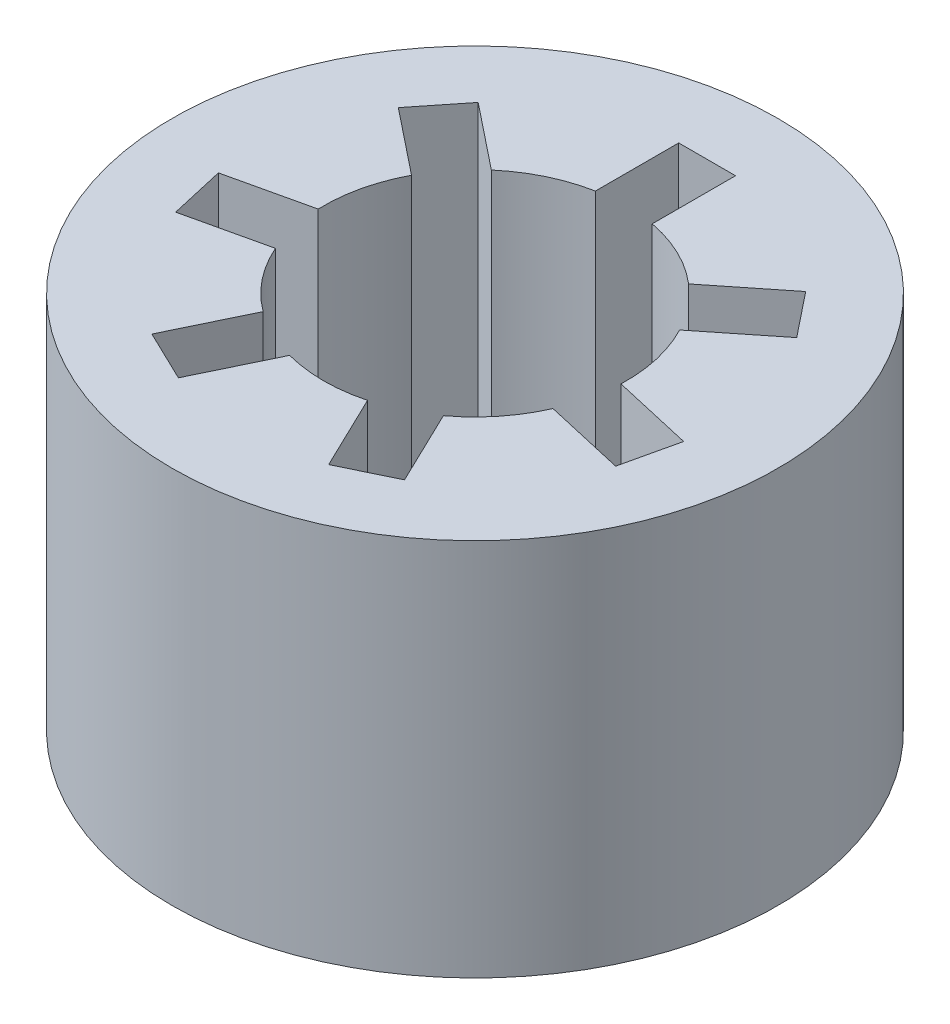
ISO-10303-21;
HEADER;
FILE_DESCRIPTION(('STEP AP214'),'2;1');
FILE_NAME('part.step','',(''),(''),'','','');
FILE_SCHEMA(('AUTOMOTIVE_DESIGN { 1 0 10303 214 1 1 1 1 }'));
ENDSEC;
DATA;
#1=APPLICATION_CONTEXT('core data for automotive mechanical design processes');
#2=APPLICATION_PROTOCOL_DEFINITION('international standard','automotive_design',2000,#1);
#3=PRODUCT_CONTEXT('',#1,'mechanical');
#4=PRODUCT('Part','Part','',(#3));
#5=PRODUCT_RELATED_PRODUCT_CATEGORY('part','',(#4));
#6=PRODUCT_DEFINITION_FORMATION('','',#4);
#7=PRODUCT_DEFINITION_CONTEXT('part definition',#1,'design');
#8=PRODUCT_DEFINITION('design','',#6,#7);
#9=PRODUCT_DEFINITION_SHAPE('','',#8);
#10=(LENGTH_UNIT() NAMED_UNIT(*) SI_UNIT(.MILLI.,.METRE.));
#11=(NAMED_UNIT(*) PLANE_ANGLE_UNIT() SI_UNIT($,.RADIAN.));
#12=(NAMED_UNIT(*) SI_UNIT($,.STERADIAN.) SOLID_ANGLE_UNIT());
#13=UNCERTAINTY_MEASURE_WITH_UNIT(LENGTH_MEASURE(1.E-05),#10,'distance_accuracy_value','');
#14=(GEOMETRIC_REPRESENTATION_CONTEXT(3) GLOBAL_UNCERTAINTY_ASSIGNED_CONTEXT((#13)) GLOBAL_UNIT_ASSIGNED_CONTEXT((#10,
#11,#12)) REPRESENTATION_CONTEXT('',''));
#15=CARTESIAN_POINT('',(0.,0.,0.));
#16=DIRECTION('',(0.,0.,1.));
#17=DIRECTION('',(1.,0.,0.));
#18=AXIS2_PLACEMENT_3D('',#15,#16,#17);
#19=CARTESIAN_POINT('',(0.,10.,0.));
#20=DIRECTION('',(0.,1.,0.));
#21=DIRECTION('',(0.,0.,1.));
#22=AXIS2_PLACEMENT_3D('',#19,#20,#21);
#23=PLANE('',#22);
#24=CARTESIAN_POINT('',(0.,10.,0.));
#25=DIRECTION('',(0.,1.,0.));
#26=DIRECTION('',(0.,0.,1.));
#27=AXIS2_PLACEMENT_3D('',#24,#25,#26);
#28=CIRCLE('',#27,8.);
#29=CARTESIAN_POINT('',(0.,10.,8.));
#30=VERTEX_POINT('',#29);
#31=EDGE_CURVE('E11',#30,#30,#28,.T.);
#32=ORIENTED_EDGE('',*,*,#31,.T.);
#33=EDGE_LOOP('',(#32));
#34=FACE_BOUND('',#33,.T.);
#35=DIRECTION('',(-0.623489801858734,0.,0.78183148246803));
#36=VECTOR('',#35,1.);
#37=CARTESIAN_POINT('',(-5.2595081752927,10.,-3.23503180263748));
#38=LINE('',#37,#36);
#39=CARTESIAN_POINT('',(-4.3242734725046,10.,-4.40777902633952));
#40=VERTEX_POINT('',#39);
#41=CARTESIAN_POINT('',(-5.2595081752927,10.,-3.23503180263748));
#42=VERTEX_POINT('',#41);
#43=EDGE_CURVE('E239',#40,#42,#38,.T.);
#44=ORIENTED_EDGE('',*,*,#43,.F.);
#45=DIRECTION('',(-0.78183148246803,0.,-0.623489801858733));
#46=VECTOR('',#45,1.);
#47=CARTESIAN_POINT('',(-2.60424421107493,10.,-3.03610146225031));
#48=LINE('',#47,#46);
#49=CARTESIAN_POINT('',(-2.60424421107493,10.,-3.03610146225031));
#50=VERTEX_POINT('',#49);
#51=EDGE_CURVE('E229',#50,#40,#48,.T.);
#52=ORIENTED_EDGE('',*,*,#51,.F.);
#53=CARTESIAN_POINT('',(0.,10.,0.));
#54=DIRECTION('',(0.,1.,0.));
#55=DIRECTION('',(0.,0.,1.));
#56=AXIS2_PLACEMENT_3D('',#53,#54,#55);
#57=CIRCLE('',#56,4.);
#58=CARTESIAN_POINT('',(-0.75,10.,-3.92905841137543));
#59=VERTEX_POINT('',#58);
#60=EDGE_CURVE('E238',#59,#50,#57,.T.);
#61=ORIENTED_EDGE('',*,*,#60,.F.);
#62=DIRECTION('',(0.,0.,1.));
#63=VECTOR('',#62,1.);
#64=CARTESIAN_POINT('',(-0.75,10.,-3.92905841137543));
#65=LINE('',#64,#63);
#66=CARTESIAN_POINT('',(-0.75,10.,-6.12905841137543));
#67=VERTEX_POINT('',#66);
#68=EDGE_CURVE('E340',#67,#59,#65,.T.);
#69=ORIENTED_EDGE('',*,*,#68,.F.);
#70=DIRECTION('',(-1.,0.,0.));
#71=VECTOR('',#70,1.);
#72=CARTESIAN_POINT('',(-0.75,10.,-6.12905841137543));
#73=LINE('',#72,#71);
#74=CARTESIAN_POINT('',(0.75,10.,-6.12905841137543));
#75=VERTEX_POINT('',#74);
#76=EDGE_CURVE('E256',#75,#67,#73,.T.);
#77=ORIENTED_EDGE('',*,*,#76,.F.);
#78=DIRECTION('',(0.,0.,-1.));
#79=VECTOR('',#78,1.);
#80=CARTESIAN_POINT('',(0.75,10.,-3.92905841137543));
#81=LINE('',#80,#79);
#82=CARTESIAN_POINT('',(0.75,10.,-3.92905841137543));
#83=VERTEX_POINT('',#82);
#84=EDGE_CURVE('E338',#83,#75,#81,.T.);
#85=ORIENTED_EDGE('',*,*,#84,.F.);
#86=CARTESIAN_POINT('',(2.60424421107497,10.,-3.03610146225098));
#87=VERTEX_POINT('',#86);
#88=EDGE_CURVE('E247',#87,#83,#57,.T.);
#89=ORIENTED_EDGE('',*,*,#88,.F.);
#90=DIRECTION('',(-0.78183148246803,0.,0.623489801858733));
#91=VECTOR('',#90,1.);
#92=CARTESIAN_POINT('',(2.60424421107544,10.,-3.03610146225135));
#93=LINE('',#92,#91);
#94=CARTESIAN_POINT('',(4.3242734725051,10.,-4.40777902634056));
#95=VERTEX_POINT('',#94);
#96=EDGE_CURVE('E48',#95,#87,#93,.T.);
#97=ORIENTED_EDGE('',*,*,#96,.F.);
#98=DIRECTION('',(-0.623489801858734,0.,-0.78183148246803));
#99=VECTOR('',#98,1.);
#100=CARTESIAN_POINT('',(4.3242734725051,10.,-4.40777902634056));
#101=LINE('',#100,#99);
#102=CARTESIAN_POINT('',(5.2595081752932,10.,-3.23503180263852));
#103=VERTEX_POINT('',#102);
#104=EDGE_CURVE('E313',#103,#95,#101,.T.);
#105=ORIENTED_EDGE('',*,*,#104,.F.);
#106=DIRECTION('',(0.78183148246803,0.,-0.623489801858734));
#107=VECTOR('',#106,1.);
#108=CARTESIAN_POINT('',(3.53947891386354,10.,-1.86335423854931));
#109=LINE('',#108,#107);
#110=CARTESIAN_POINT('',(3.53947891386354,10.,-1.86335423854931));
#111=VERTEX_POINT('',#110);
#112=EDGE_CURVE('E311',#111,#103,#109,.T.);
#113=ORIENTED_EDGE('',*,*,#112,.F.);
#114=CARTESIAN_POINT('',(3.99743941430994,10.,0.143101813131102));
#115=VERTEX_POINT('',#114);
#116=EDGE_CURVE('E251',#115,#111,#57,.T.);
#117=ORIENTED_EDGE('',*,*,#116,.F.);
#118=DIRECTION('',(-0.974927912181824,0.,-0.222520933956315));
#119=VECTOR('',#118,1.);
#120=CARTESIAN_POINT('',(3.99743941431086,10.,0.143101813131312));
#121=LINE('',#120,#119);
#122=CARTESIAN_POINT('',(6.14228082111087,10.,0.632647867835205));
#123=VERTEX_POINT('',#122);
#124=EDGE_CURVE('E56',#123,#115,#121,.T.);
#125=ORIENTED_EDGE('',*,*,#124,.F.);
#126=DIRECTION('',(0.222520933956314,0.,-0.974927912181824));
#127=VECTOR('',#126,1.);
#128=CARTESIAN_POINT('',(6.14228082111087,10.,0.632647867835205));
#129=LINE('',#128,#127);
#130=CARTESIAN_POINT('',(5.8084994201764,10.,2.09503973610794));
#131=VERTEX_POINT('',#130);
#132=EDGE_CURVE('E450',#131,#123,#129,.T.);
#133=ORIENTED_EDGE('',*,*,#132,.F.);
#134=DIRECTION('',(0.974927912181824,0.,0.222520933956314));
#135=VECTOR('',#134,1.);
#136=CARTESIAN_POINT('',(3.66365801337639,10.,1.60549368140405));
#137=LINE('',#136,#135);
#138=CARTESIAN_POINT('',(3.66365801337639,10.,1.60549368140405));
#139=VERTEX_POINT('',#138);
#140=EDGE_CURVE('E453',#139,#131,#137,.T.);
#141=ORIENTED_EDGE('',*,*,#140,.F.);
#142=CARTESIAN_POINT('',(2.38048120566667,10.,3.21454650448049));
#143=VERTEX_POINT('',#142);
#144=EDGE_CURVE('E287',#143,#139,#57,.T.);
#145=ORIENTED_EDGE('',*,*,#144,.F.);
#146=DIRECTION('',(-0.433883739117558,0.,-0.900968867902419));
#147=VECTOR('',#146,1.);
#148=CARTESIAN_POINT('',(2.380481205667,10.,3.21454650448118));
#149=LINE('',#148,#147);
#150=CARTESIAN_POINT('',(3.33502543172563,10.,5.19667801386651));
#151=VERTEX_POINT('',#150);
#152=EDGE_CURVE('E401',#151,#143,#149,.T.);
#153=ORIENTED_EDGE('',*,*,#152,.F.);
#154=DIRECTION('',(0.900968867902419,0.,-0.433883739117558));
#155=VECTOR('',#154,1.);
#156=CARTESIAN_POINT('',(3.33502543172563,10.,5.19667801386651));
#157=LINE('',#156,#155);
#158=CARTESIAN_POINT('',(1.983572129872,10.,5.84750362254284));
#159=VERTEX_POINT('',#158);
#160=EDGE_CURVE('E427',#159,#151,#157,.T.);
#161=ORIENTED_EDGE('',*,*,#160,.F.);
#162=DIRECTION('',(0.433883739117558,0.,0.900968867902419));
#163=VECTOR('',#162,1.);
#164=CARTESIAN_POINT('',(1.02902790381338,10.,3.86537211315752));
#165=LINE('',#164,#163);
#166=CARTESIAN_POINT('',(1.02902790381338,10.,3.86537211315752));
#167=VERTEX_POINT('',#166);
#168=EDGE_CURVE('E430',#167,#159,#165,.T.);
#169=ORIENTED_EDGE('',*,*,#168,.F.);
#170=CARTESIAN_POINT('',(-1.02902790381074,10.,3.86537211315791));
#171=VERTEX_POINT('',#170);
#172=EDGE_CURVE('E281',#171,#167,#57,.T.);
#173=ORIENTED_EDGE('',*,*,#172,.F.);
#174=DIRECTION('',(0.433883739117558,0.,-0.900968867902419));
#175=VECTOR('',#174,1.);
#176=CARTESIAN_POINT('',(-1.02902790381083,10.,3.8653721131581));
#177=LINE('',#176,#175);
#178=CARTESIAN_POINT('',(-1.98357212986946,10.,5.84750362254342));
#179=VERTEX_POINT('',#178);
#180=EDGE_CURVE('E375',#179,#171,#177,.T.);
#181=ORIENTED_EDGE('',*,*,#180,.F.);
#182=DIRECTION('',(0.900968867902419,0.,0.433883739117558));
#183=VECTOR('',#182,1.);
#184=CARTESIAN_POINT('',(-1.98357212986946,10.,5.84750362254342));
#185=LINE('',#184,#183);
#186=CARTESIAN_POINT('',(-3.33502543172309,10.,5.19667801386709));
#187=VERTEX_POINT('',#186);
#188=EDGE_CURVE('E403',#187,#179,#185,.T.);
#189=ORIENTED_EDGE('',*,*,#188,.F.);
#190=DIRECTION('',(-0.433883739117558,0.,0.900968867902419));
#191=VECTOR('',#190,1.);
#192=CARTESIAN_POINT('',(-2.38048120566446,10.,3.21454650448176));
#193=LINE('',#192,#191);
#194=CARTESIAN_POINT('',(-2.38048120566446,10.,3.21454650448176));
#195=VERTEX_POINT('',#194);
#196=EDGE_CURVE('E406',#195,#187,#193,.T.);
#197=ORIENTED_EDGE('',*,*,#196,.F.);
#198=CARTESIAN_POINT('',(-3.66365801337506,10.,1.60549368140542));
#199=VERTEX_POINT('',#198);
#200=EDGE_CURVE('E275',#199,#195,#57,.T.);
#201=ORIENTED_EDGE('',*,*,#200,.F.);
#202=DIRECTION('',(0.974927912181824,0.,-0.222520933956314));
#203=VECTOR('',#202,1.);
#204=CARTESIAN_POINT('',(-3.66365801337475,10.,1.60549368140535));
#205=LINE('',#204,#203);
#206=CARTESIAN_POINT('',(-5.80849942017476,10.,2.09503973610924));
#207=VERTEX_POINT('',#206);
#208=EDGE_CURVE('E396',#207,#199,#205,.T.);
#209=ORIENTED_EDGE('',*,*,#208,.F.);
#210=DIRECTION('',(0.222520933956314,0.,0.974927912181824));
#211=VECTOR('',#210,1.);
#212=CARTESIAN_POINT('',(-5.80849942017476,10.,2.09503973610924));
#213=LINE('',#212,#211);
#214=CARTESIAN_POINT('',(-6.14228082110924,10.,0.632647867836507));
#215=VERTEX_POINT('',#214);
#216=EDGE_CURVE('E377',#215,#207,#213,.T.);
#217=ORIENTED_EDGE('',*,*,#216,.F.);
#218=DIRECTION('',(-0.974927912181824,0.,0.222520933956315));
#219=VECTOR('',#218,1.);
#220=CARTESIAN_POINT('',(-3.99743941430922,10.,0.143101813132614));
#221=LINE('',#220,#219);
#222=CARTESIAN_POINT('',(-3.99743941430922,10.,0.143101813132614));
#223=VERTEX_POINT('',#222);
#224=EDGE_CURVE('E380',#223,#215,#221,.T.);
#225=ORIENTED_EDGE('',*,*,#224,.F.);
#226=CARTESIAN_POINT('',(-3.53947891386335,10.,-1.86335423854852));
#227=VERTEX_POINT('',#226);
#228=EDGE_CURVE('E272',#227,#223,#57,.T.);
#229=ORIENTED_EDGE('',*,*,#228,.F.);
#230=DIRECTION('',(0.78183148246803,0.,0.623489801858734));
#231=VECTOR('',#230,1.);
#232=CARTESIAN_POINT('',(-3.53947891386303,10.,-1.86335423854826));
#233=LINE('',#232,#231);
#234=EDGE_CURVE('E336',#42,#227,#233,.T.);
#235=ORIENTED_EDGE('',*,*,#234,.F.);
#236=EDGE_LOOP('',(#44,#52,#61,#69,#77,#85,#89,#97,#105,#113,#117,#125,#133,#141,#145,#153,#161,
#169,#173,#181,#189,#197,#201,#209,#217,#225,#229,#235));
#237=FACE_BOUND('',#236,.T.);
#238=ADVANCED_FACE('F33',(#34,#237),#23,.T.);
#239=CARTESIAN_POINT('',(0.,0.,0.));
#240=DIRECTION('',(0.,1.,0.));
#241=DIRECTION('',(0.,0.,1.));
#242=AXIS2_PLACEMENT_3D('',#239,#240,#241);
#243=PLANE('',#242);
#244=CARTESIAN_POINT('',(0.,0.,0.));
#245=DIRECTION('',(0.,1.,0.));
#246=DIRECTION('',(0.,0.,1.));
#247=AXIS2_PLACEMENT_3D('',#244,#245,#246);
#248=CIRCLE('',#247,8.);
#249=CARTESIAN_POINT('',(0.,0.,8.));
#250=VERTEX_POINT('',#249);
#251=EDGE_CURVE('E37',#250,#250,#248,.T.);
#252=ORIENTED_EDGE('',*,*,#251,.F.);
#253=EDGE_LOOP('',(#252));
#254=FACE_BOUND('',#253,.T.);
#255=DIRECTION('',(-0.78183148246803,0.,-0.623489801858733));
#256=VECTOR('',#255,1.);
#257=CARTESIAN_POINT('',(-2.60424421107493,0.,-3.03610146225031));
#258=LINE('',#257,#256);
#259=CARTESIAN_POINT('',(-2.60424421107535,0.,-3.03610146225065));
#260=VERTEX_POINT('',#259);
#261=CARTESIAN_POINT('',(-4.3242734725046,0.,-4.40777902633952));
#262=VERTEX_POINT('',#261);
#263=EDGE_CURVE('E217',#260,#262,#258,.T.);
#264=ORIENTED_EDGE('',*,*,#263,.T.);
#265=DIRECTION('',(-0.623489801858733,0.,0.78183148246803));
#266=VECTOR('',#265,1.);
#267=CARTESIAN_POINT('',(-5.2595081752927,0.,-3.23503180263748));
#268=LINE('',#267,#266);
#269=CARTESIAN_POINT('',(-5.2595081752927,0.,-3.23503180263748));
#270=VERTEX_POINT('',#269);
#271=EDGE_CURVE('E228',#262,#270,#268,.T.);
#272=ORIENTED_EDGE('',*,*,#271,.T.);
#273=DIRECTION('',(0.78183148246803,0.,0.623489801858734));
#274=VECTOR('',#273,1.);
#275=CARTESIAN_POINT('',(-3.53947891386303,0.,-1.86335423854826));
#276=LINE('',#275,#274);
#277=CARTESIAN_POINT('',(-3.53947891386303,0.,-1.86335423854826));
#278=VERTEX_POINT('',#277);
#279=EDGE_CURVE('E365',#270,#278,#276,.T.);
#280=ORIENTED_EDGE('',*,*,#279,.T.);
#281=CARTESIAN_POINT('',(0.,0.,0.));
#282=DIRECTION('',(0.,1.,0.));
#283=DIRECTION('',(0.,0.,1.));
#284=AXIS2_PLACEMENT_3D('',#281,#282,#283);
#285=CIRCLE('',#284,4.);
#286=CARTESIAN_POINT('',(-3.99743941430988,0.,0.143101813132764));
#287=VERTEX_POINT('',#286);
#288=EDGE_CURVE('E248',#278,#287,#285,.T.);
#289=ORIENTED_EDGE('',*,*,#288,.T.);
#290=DIRECTION('',(-0.974927912181824,0.,0.222520933956315));
#291=VECTOR('',#290,1.);
#292=CARTESIAN_POINT('',(-3.99743941430922,0.,0.143101813132614));
#293=LINE('',#292,#291);
#294=CARTESIAN_POINT('',(-6.14228082110924,0.,0.632647867836507));
#295=VERTEX_POINT('',#294);
#296=EDGE_CURVE('E383',#287,#295,#293,.T.);
#297=ORIENTED_EDGE('',*,*,#296,.T.);
#298=DIRECTION('',(0.222520933956314,0.,0.974927912181824));
#299=VECTOR('',#298,1.);
#300=CARTESIAN_POINT('',(-5.80849942017476,0.,2.09503973610924));
#301=LINE('',#300,#299);
#302=CARTESIAN_POINT('',(-5.80849942017476,0.,2.09503973610924));
#303=VERTEX_POINT('',#302);
#304=EDGE_CURVE('E386',#295,#303,#301,.T.);
#305=ORIENTED_EDGE('',*,*,#304,.T.);
#306=DIRECTION('',(0.974927912181824,0.,-0.222520933956314));
#307=VECTOR('',#306,1.);
#308=CARTESIAN_POINT('',(-3.66365801337475,0.,1.60549368140535));
#309=LINE('',#308,#307);
#310=CARTESIAN_POINT('',(-3.66365801337475,0.,1.60549368140535));
#311=VERTEX_POINT('',#310);
#312=EDGE_CURVE('E389',#303,#311,#309,.T.);
#313=ORIENTED_EDGE('',*,*,#312,.T.);
#314=CARTESIAN_POINT('',(-2.38048120566459,0.,3.21454650448203));
#315=VERTEX_POINT('',#314);
#316=EDGE_CURVE('E254',#311,#315,#285,.T.);
#317=ORIENTED_EDGE('',*,*,#316,.T.);
#318=DIRECTION('',(-0.433883739117558,0.,0.900968867902419));
#319=VECTOR('',#318,1.);
#320=CARTESIAN_POINT('',(-2.38048120566446,0.,3.21454650448176));
#321=LINE('',#320,#319);
#322=CARTESIAN_POINT('',(-3.33502543172309,0.,5.19667801386709));
#323=VERTEX_POINT('',#322);
#324=EDGE_CURVE('E409',#315,#323,#321,.T.);
#325=ORIENTED_EDGE('',*,*,#324,.T.);
#326=DIRECTION('',(0.900968867902419,0.,0.433883739117558));
#327=VECTOR('',#326,1.);
#328=CARTESIAN_POINT('',(-1.98357212986946,0.,5.84750362254342));
#329=LINE('',#328,#327);
#330=CARTESIAN_POINT('',(-1.98357212986946,0.,5.84750362254342));
#331=VERTEX_POINT('',#330);
#332=EDGE_CURVE('E412',#323,#331,#329,.T.);
#333=ORIENTED_EDGE('',*,*,#332,.T.);
#334=DIRECTION('',(0.433883739117558,0.,-0.900968867902419));
#335=VECTOR('',#334,1.);
#336=CARTESIAN_POINT('',(-1.02902790381083,0.,3.8653721131581));
#337=LINE('',#336,#335);
#338=CARTESIAN_POINT('',(-1.02902790381083,0.,3.8653721131581));
#339=VERTEX_POINT('',#338);
#340=EDGE_CURVE('E415',#331,#339,#337,.T.);
#341=ORIENTED_EDGE('',*,*,#340,.T.);
#342=CARTESIAN_POINT('',(1.02902790381481,0.,3.86537211315683));
#343=VERTEX_POINT('',#342);
#344=EDGE_CURVE('E485',#339,#343,#285,.T.);
#345=ORIENTED_EDGE('',*,*,#344,.T.);
#346=DIRECTION('',(0.433883739117558,0.,0.900968867902419));
#347=VECTOR('',#346,1.);
#348=CARTESIAN_POINT('',(1.02902790381338,0.,3.86537211315752));
#349=LINE('',#348,#347);
#350=CARTESIAN_POINT('',(1.983572129872,0.,5.84750362254284));
#351=VERTEX_POINT('',#350);
#352=EDGE_CURVE('E433',#343,#351,#349,.T.);
#353=ORIENTED_EDGE('',*,*,#352,.T.);
#354=DIRECTION('',(0.900968867902419,0.,-0.433883739117558));
#355=VECTOR('',#354,1.);
#356=CARTESIAN_POINT('',(3.33502543172563,0.,5.19667801386651));
#357=LINE('',#356,#355);
#358=CARTESIAN_POINT('',(3.33502543172563,0.,5.19667801386651));
#359=VERTEX_POINT('',#358);
#360=EDGE_CURVE('E436',#351,#359,#357,.T.);
#361=ORIENTED_EDGE('',*,*,#360,.T.);
#362=DIRECTION('',(-0.433883739117558,0.,-0.900968867902419));
#363=VECTOR('',#362,1.);
#364=CARTESIAN_POINT('',(2.380481205667,0.,3.21454650448118));
#365=LINE('',#364,#363);
#366=CARTESIAN_POINT('',(2.380481205667,0.,3.21454650448118));
#367=VERTEX_POINT('',#366);
#368=EDGE_CURVE('E439',#359,#367,#365,.T.);
#369=ORIENTED_EDGE('',*,*,#368,.T.);
#370=CARTESIAN_POINT('',(3.66365801337718,0.,1.60549368140058));
#371=VERTEX_POINT('',#370);
#372=EDGE_CURVE('E262',#367,#371,#285,.T.);
#373=ORIENTED_EDGE('',*,*,#372,.T.);
#374=DIRECTION('',(0.974927912181824,0.,0.222520933956314));
#375=VECTOR('',#374,1.);
#376=CARTESIAN_POINT('',(3.66365801337639,0.,1.60549368140405));
#377=LINE('',#376,#375);
#378=CARTESIAN_POINT('',(5.8084994201764,0.,2.09503973610794));
#379=VERTEX_POINT('',#378);
#380=EDGE_CURVE('E456',#371,#379,#377,.T.);
#381=ORIENTED_EDGE('',*,*,#380,.T.);
#382=DIRECTION('',(0.222520933956314,0.,-0.974927912181824));
#383=VECTOR('',#382,1.);
#384=CARTESIAN_POINT('',(6.14228082111087,0.,0.632647867835205));
#385=LINE('',#384,#383);
#386=CARTESIAN_POINT('',(6.14228082111087,0.,0.632647867835205));
#387=VERTEX_POINT('',#386);
#388=EDGE_CURVE('E459',#379,#387,#385,.T.);
#389=ORIENTED_EDGE('',*,*,#388,.T.);
#390=DIRECTION('',(-0.974927912181823,0.,-0.222520933956315));
#391=VECTOR('',#390,1.);
#392=CARTESIAN_POINT('',(3.99743941431086,0.,0.143101813131312));
#393=LINE('',#392,#391);
#394=CARTESIAN_POINT('',(3.99743941431086,0.,0.143101813131312));
#395=VERTEX_POINT('',#394);
#396=EDGE_CURVE('E462',#387,#395,#393,.T.);
#397=ORIENTED_EDGE('',*,*,#396,.T.);
#398=CARTESIAN_POINT('',(3.53947891386176,0.,-1.86335423855153));
#399=VERTEX_POINT('',#398);
#400=EDGE_CURVE('E255',#395,#399,#285,.T.);
#401=ORIENTED_EDGE('',*,*,#400,.T.);
#402=DIRECTION('',(0.78183148246803,0.,-0.623489801858734));
#403=VECTOR('',#402,1.);
#404=CARTESIAN_POINT('',(3.53947891386354,0.,-1.86335423854931));
#405=LINE('',#404,#403);
#406=CARTESIAN_POINT('',(5.2595081752932,0.,-3.23503180263852));
#407=VERTEX_POINT('',#406);
#408=EDGE_CURVE('E315',#399,#407,#405,.T.);
#409=ORIENTED_EDGE('',*,*,#408,.T.);
#410=DIRECTION('',(-0.623489801858734,0.,-0.78183148246803));
#411=VECTOR('',#410,1.);
#412=CARTESIAN_POINT('',(4.3242734725051,0.,-4.40777902634056));
#413=LINE('',#412,#411);
#414=CARTESIAN_POINT('',(4.3242734725051,0.,-4.40777902634056));
#415=VERTEX_POINT('',#414);
#416=EDGE_CURVE('E318',#407,#415,#413,.T.);
#417=ORIENTED_EDGE('',*,*,#416,.T.);
#418=DIRECTION('',(-0.78183148246803,0.,0.623489801858733));
#419=VECTOR('',#418,1.);
#420=CARTESIAN_POINT('',(2.60424421107544,0.,-3.03610146225135));
#421=LINE('',#420,#419);
#422=CARTESIAN_POINT('',(2.60424421107544,0.,-3.03610146225135));
#423=VERTEX_POINT('',#422);
#424=EDGE_CURVE('E325',#415,#423,#421,.T.);
#425=ORIENTED_EDGE('',*,*,#424,.T.);
#426=CARTESIAN_POINT('',(0.75,0.,-3.92905841137543));
#427=VERTEX_POINT('',#426);
#428=EDGE_CURVE('E250',#423,#427,#285,.T.);
#429=ORIENTED_EDGE('',*,*,#428,.T.);
#430=DIRECTION('',(0.,0.,-1.));
#431=VECTOR('',#430,1.);
#432=CARTESIAN_POINT('',(0.75,0.,-3.92905841137543));
#433=LINE('',#432,#431);
#434=CARTESIAN_POINT('',(0.75,0.,-6.12905841137543));
#435=VERTEX_POINT('',#434);
#436=EDGE_CURVE('E343',#427,#435,#433,.T.);
#437=ORIENTED_EDGE('',*,*,#436,.T.);
#438=DIRECTION('',(-1.,0.,0.));
#439=VECTOR('',#438,1.);
#440=CARTESIAN_POINT('',(-0.75,0.,-6.12905841137543));
#441=LINE('',#440,#439);
#442=CARTESIAN_POINT('',(-0.75,0.,-6.12905841137543));
#443=VERTEX_POINT('',#442);
#444=EDGE_CURVE('E345',#435,#443,#441,.T.);
#445=ORIENTED_EDGE('',*,*,#444,.T.);
#446=DIRECTION('',(0.,0.,1.));
#447=VECTOR('',#446,1.);
#448=CARTESIAN_POINT('',(-0.75,0.,-3.92905841137543));
#449=LINE('',#448,#447);
#450=CARTESIAN_POINT('',(-0.75,0.,-3.92905841137543));
#451=VERTEX_POINT('',#450);
#452=EDGE_CURVE('E246',#443,#451,#449,.T.);
#453=ORIENTED_EDGE('',*,*,#452,.T.);
#454=EDGE_CURVE('E236',#451,#260,#285,.T.);
#455=ORIENTED_EDGE('',*,*,#454,.T.);
#456=EDGE_LOOP('',(#264,#272,#280,#289,#297,#305,#313,#317,#325,#333,#341,#345,#353,#361,#369,
#373,#381,#389,#397,#401,#409,#417,#425,#429,#437,#445,#453,#455));
#457=FACE_BOUND('',#456,.T.);
#458=ADVANCED_FACE('F243',(#254,#457),#243,.F.);
#459=CARTESIAN_POINT('',(0.,10.,0.));
#460=DIRECTION('',(0.,-1.,0.));
#461=DIRECTION('',(0.,0.,-1.));
#462=AXIS2_PLACEMENT_3D('',#459,#460,#461);
#463=CYLINDRICAL_SURFACE('',#462,4.);
#464=ORIENTED_EDGE('',*,*,#60,.T.);
#465=DIRECTION('',(0.,-1.,0.));
#466=VECTOR('',#465,1.);
#467=CARTESIAN_POINT('',(-2.60424421107535,10.,-3.03610146225065));
#468=LINE('',#467,#466);
#469=EDGE_CURVE('E221',#260,#50,#468,.F.);
#470=ORIENTED_EDGE('',*,*,#469,.F.);
#471=ORIENTED_EDGE('',*,*,#454,.F.);
#472=DIRECTION('',(0.,-1.,0.));
#473=VECTOR('',#472,1.);
#474=CARTESIAN_POINT('',(-0.75,10.,-3.92905841137543));
#475=LINE('',#474,#473);
#476=EDGE_CURVE('E335',#59,#451,#475,.T.);
#477=ORIENTED_EDGE('',*,*,#476,.F.);
#478=EDGE_LOOP('',(#464,#470,#471,#477));
#479=FACE_BOUND('',#478,.T.);
#480=ADVANCED_FACE('F234',(#479),#463,.F.);
#481=ORIENTED_EDGE('',*,*,#288,.F.);
#482=DIRECTION('',(0.,-1.,0.));
#483=VECTOR('',#482,1.);
#484=CARTESIAN_POINT('',(-3.53947891386335,10.,-1.86335423854852));
#485=LINE('',#484,#483);
#486=EDGE_CURVE('E240',#227,#278,#485,.T.);
#487=ORIENTED_EDGE('',*,*,#486,.F.);
#488=ORIENTED_EDGE('',*,*,#228,.T.);
#489=DIRECTION('',(0.,-1.,0.));
#490=VECTOR('',#489,1.);
#491=CARTESIAN_POINT('',(-3.99743941430988,10.,0.143101813132764));
#492=LINE('',#491,#490);
#493=EDGE_CURVE('E374',#287,#223,#492,.F.);
#494=ORIENTED_EDGE('',*,*,#493,.F.);
#495=EDGE_LOOP('',(#481,#487,#488,#494));
#496=FACE_BOUND('',#495,.T.);
#497=ADVANCED_FACE('F531',(#496),#463,.F.);
#498=ORIENTED_EDGE('',*,*,#316,.F.);
#499=DIRECTION('',(0.,-1.,0.));
#500=VECTOR('',#499,1.);
#501=CARTESIAN_POINT('',(-3.66365801337506,10.,1.60549368140542));
#502=LINE('',#501,#500);
#503=EDGE_CURVE('E372',#199,#311,#502,.T.);
#504=ORIENTED_EDGE('',*,*,#503,.F.);
#505=ORIENTED_EDGE('',*,*,#200,.T.);
#506=DIRECTION('',(0.,-1.,0.));
#507=VECTOR('',#506,1.);
#508=CARTESIAN_POINT('',(-2.38048120566459,10.,3.21454650448203));
#509=LINE('',#508,#507);
#510=EDGE_CURVE('E400',#315,#195,#509,.F.);
#511=ORIENTED_EDGE('',*,*,#510,.F.);
#512=EDGE_LOOP('',(#498,#504,#505,#511));
#513=FACE_BOUND('',#512,.T.);
#514=ADVANCED_FACE('F491',(#513),#463,.F.);
#515=ORIENTED_EDGE('',*,*,#344,.F.);
#516=DIRECTION('',(0.,-1.,0.));
#517=VECTOR('',#516,1.);
#518=CARTESIAN_POINT('',(-1.02902790381074,10.,3.86537211315791));
#519=LINE('',#518,#517);
#520=EDGE_CURVE('E398',#171,#339,#519,.T.);
#521=ORIENTED_EDGE('',*,*,#520,.F.);
#522=ORIENTED_EDGE('',*,*,#172,.T.);
#523=DIRECTION('',(0.,-1.,0.));
#524=VECTOR('',#523,1.);
#525=CARTESIAN_POINT('',(1.02902790381324,10.,3.86537211315725));
#526=LINE('',#525,#524);
#527=EDGE_CURVE('E425',#343,#167,#526,.F.);
#528=ORIENTED_EDGE('',*,*,#527,.F.);
#529=EDGE_LOOP('',(#515,#521,#522,#528));
#530=FACE_BOUND('',#529,.T.);
#531=ADVANCED_FACE('F503',(#530),#463,.F.);
#532=ORIENTED_EDGE('',*,*,#372,.F.);
#533=DIRECTION('',(0.,-1.,0.));
#534=VECTOR('',#533,1.);
#535=CARTESIAN_POINT('',(2.38048120566667,10.,3.21454650448049));
#536=LINE('',#535,#534);
#537=EDGE_CURVE('E423',#143,#367,#536,.T.);
#538=ORIENTED_EDGE('',*,*,#537,.F.);
#539=ORIENTED_EDGE('',*,*,#144,.T.);
#540=DIRECTION('',(0.,-1.,0.));
#541=VECTOR('',#540,1.);
#542=CARTESIAN_POINT('',(3.66365801337572,10.,1.6054936814039));
#543=LINE('',#542,#541);
#544=EDGE_CURVE('E448',#371,#139,#543,.F.);
#545=ORIENTED_EDGE('',*,*,#544,.F.);
#546=EDGE_LOOP('',(#532,#538,#539,#545));
#547=FACE_BOUND('',#546,.T.);
#548=ADVANCED_FACE('F483',(#547),#463,.F.);
#549=ORIENTED_EDGE('',*,*,#400,.F.);
#550=DIRECTION('',(0.,-1.,0.));
#551=VECTOR('',#550,1.);
#552=CARTESIAN_POINT('',(3.99743941430994,10.,0.143101813131102));
#553=LINE('',#552,#551);
#554=EDGE_CURVE('E304',#115,#395,#553,.T.);
#555=ORIENTED_EDGE('',*,*,#554,.F.);
#556=ORIENTED_EDGE('',*,*,#116,.T.);
#557=DIRECTION('',(0.,-1.,0.));
#558=VECTOR('',#557,1.);
#559=CARTESIAN_POINT('',(3.53947891386311,10.,-1.86335423854897));
#560=LINE('',#559,#558);
#561=EDGE_CURVE('E303',#399,#111,#560,.F.);
#562=ORIENTED_EDGE('',*,*,#561,.F.);
#563=EDGE_LOOP('',(#549,#555,#556,#562));
#564=FACE_BOUND('',#563,.T.);
#565=ADVANCED_FACE('F302',(#564),#463,.F.);
#566=ORIENTED_EDGE('',*,*,#428,.F.);
#567=DIRECTION('',(0.,-1.,0.));
#568=VECTOR('',#567,1.);
#569=CARTESIAN_POINT('',(2.60424421107497,10.,-3.03610146225098));
#570=LINE('',#569,#568);
#571=EDGE_CURVE('E358',#87,#423,#570,.T.);
#572=ORIENTED_EDGE('',*,*,#571,.F.);
#573=ORIENTED_EDGE('',*,*,#88,.T.);
#574=DIRECTION('',(0.,-1.,0.));
#575=VECTOR('',#574,1.);
#576=CARTESIAN_POINT('',(0.75,10.,-3.92905841137543));
#577=LINE('',#576,#575);
#578=EDGE_CURVE('E332',#427,#83,#577,.F.);
#579=ORIENTED_EDGE('',*,*,#578,.F.);
#580=EDGE_LOOP('',(#566,#572,#573,#579));
#581=FACE_BOUND('',#580,.T.);
#582=ADVANCED_FACE('F356',(#581),#463,.F.);
#583=CARTESIAN_POINT('',(0.,10.,0.));
#584=DIRECTION('',(0.,-1.,0.));
#585=DIRECTION('',(0.,0.,-1.));
#586=AXIS2_PLACEMENT_3D('',#583,#584,#585);
#587=CYLINDRICAL_SURFACE('',#586,8.);
#588=ORIENTED_EDGE('',*,*,#31,.F.);
#589=EDGE_LOOP('',(#588));
#590=FACE_BOUND('',#589,.T.);
#591=ORIENTED_EDGE('',*,*,#251,.T.);
#592=EDGE_LOOP('',(#591));
#593=FACE_BOUND('',#592,.T.);
#594=ADVANCED_FACE('F35',(#590,#593),#587,.T.);
#595=CARTESIAN_POINT('',(-0.75,10.001,-3.92905841137543));
#596=DIRECTION('',(1.,0.,0.));
#597=DIRECTION('',(0.,0.,-1.));
#598=AXIS2_PLACEMENT_3D('',#595,#596,#597);
#599=PLANE('',#598);
#600=ORIENTED_EDGE('',*,*,#68,.T.);
#601=ORIENTED_EDGE('',*,*,#476,.T.);
#602=ORIENTED_EDGE('',*,*,#452,.F.);
#603=DIRECTION('',(0.,-1.,0.));
#604=VECTOR('',#603,1.);
#605=CARTESIAN_POINT('',(-0.75,10.001,-6.12905841137543));
#606=LINE('',#605,#604);
#607=EDGE_CURVE('E269',#67,#443,#606,.T.);
#608=ORIENTED_EDGE('',*,*,#607,.F.);
#609=EDGE_LOOP('',(#600,#601,#602,#608));
#610=FACE_BOUND('',#609,.T.);
#611=ADVANCED_FACE('F350',(#610),#599,.T.);
#612=CARTESIAN_POINT('',(0.75,10.001,-3.92905841137543));
#613=DIRECTION('',(-1.,0.,0.));
#614=DIRECTION('',(0.,0.,1.));
#615=AXIS2_PLACEMENT_3D('',#612,#613,#614);
#616=PLANE('',#615);
#617=ORIENTED_EDGE('',*,*,#84,.T.);
#618=DIRECTION('',(0.,-1.,0.));
#619=VECTOR('',#618,1.);
#620=CARTESIAN_POINT('',(0.75,10.001,-6.12905841137543));
#621=LINE('',#620,#619);
#622=EDGE_CURVE('E263',#75,#435,#621,.T.);
#623=ORIENTED_EDGE('',*,*,#622,.T.);
#624=ORIENTED_EDGE('',*,*,#436,.F.);
#625=ORIENTED_EDGE('',*,*,#578,.T.);
#626=EDGE_LOOP('',(#617,#623,#624,#625));
#627=FACE_BOUND('',#626,.T.);
#628=ADVANCED_FACE('F353',(#627),#616,.T.);
#629=CARTESIAN_POINT('',(-0.75,10.001,-6.12905841137543));
#630=DIRECTION('',(0.,0.,1.));
#631=DIRECTION('',(1.,0.,0.));
#632=AXIS2_PLACEMENT_3D('',#629,#630,#631);
#633=PLANE('',#632);
#634=ORIENTED_EDGE('',*,*,#76,.T.);
#635=ORIENTED_EDGE('',*,*,#607,.T.);
#636=ORIENTED_EDGE('',*,*,#444,.F.);
#637=ORIENTED_EDGE('',*,*,#622,.F.);
#638=EDGE_LOOP('',(#634,#635,#636,#637));
#639=FACE_BOUND('',#638,.T.);
#640=ADVANCED_FACE('F347',(#639),#633,.T.);
#641=CARTESIAN_POINT('',(3.53947891386354,10.001,-1.86335423854931));
#642=DIRECTION('',(-0.623489801858734,0.,-0.78183148246803));
#643=DIRECTION('',(-0.78183148246803,0.,0.623489801858734));
#644=AXIS2_PLACEMENT_3D('',#641,#642,#643);
#645=PLANE('',#644);
#646=ORIENTED_EDGE('',*,*,#112,.T.);
#647=DIRECTION('',(0.,-1.,0.));
#648=VECTOR('',#647,1.);
#649=CARTESIAN_POINT('',(5.2595081752932,10.001,-3.23503180263852));
#650=LINE('',#649,#648);
#651=EDGE_CURVE('E329',#103,#407,#650,.T.);
#652=ORIENTED_EDGE('',*,*,#651,.T.);
#653=ORIENTED_EDGE('',*,*,#408,.F.);
#654=ORIENTED_EDGE('',*,*,#561,.T.);
#655=EDGE_LOOP('',(#646,#652,#653,#654));
#656=FACE_BOUND('',#655,.T.);
#657=ADVANCED_FACE('F470',(#656),#645,.T.);
#658=CARTESIAN_POINT('',(4.3242734725051,10.001,-4.40777902634056));
#659=DIRECTION('',(-0.78183148246803,0.,0.623489801858734));
#660=DIRECTION('',(0.623489801858734,0.,0.78183148246803));
#661=AXIS2_PLACEMENT_3D('',#658,#659,#660);
#662=PLANE('',#661);
#663=ORIENTED_EDGE('',*,*,#104,.T.);
#664=DIRECTION('',(0.,-1.,0.));
#665=VECTOR('',#664,1.);
#666=CARTESIAN_POINT('',(4.3242734725051,10.001,-4.40777902634056));
#667=LINE('',#666,#665);
#668=EDGE_CURVE('E327',#95,#415,#667,.T.);
#669=ORIENTED_EDGE('',*,*,#668,.T.);
#670=ORIENTED_EDGE('',*,*,#416,.F.);
#671=ORIENTED_EDGE('',*,*,#651,.F.);
#672=EDGE_LOOP('',(#663,#669,#670,#671));
#673=FACE_BOUND('',#672,.T.);
#674=ADVANCED_FACE('F540',(#673),#662,.T.);
#675=CARTESIAN_POINT('',(2.60424421107544,10.001,-3.03610146225135));
#676=DIRECTION('',(0.623489801858733,0.,0.78183148246803));
#677=DIRECTION('',(0.78183148246803,0.,-0.623489801858733));
#678=AXIS2_PLACEMENT_3D('',#675,#676,#677);
#679=PLANE('',#678);
#680=ORIENTED_EDGE('',*,*,#96,.T.);
#681=ORIENTED_EDGE('',*,*,#571,.T.);
#682=ORIENTED_EDGE('',*,*,#424,.F.);
#683=ORIENTED_EDGE('',*,*,#668,.F.);
#684=EDGE_LOOP('',(#680,#681,#682,#683));
#685=FACE_BOUND('',#684,.T.);
#686=ADVANCED_FACE('F543',(#685),#679,.T.);
#687=CARTESIAN_POINT('',(3.66365801337639,10.001,1.60549368140405));
#688=DIRECTION('',(0.222520933956314,0.,-0.974927912181824));
#689=DIRECTION('',(-0.974927912181824,0.,-0.222520933956314));
#690=AXIS2_PLACEMENT_3D('',#687,#688,#689);
#691=PLANE('',#690);
#692=ORIENTED_EDGE('',*,*,#140,.T.);
#693=DIRECTION('',(0.,-1.,0.));
#694=VECTOR('',#693,1.);
#695=CARTESIAN_POINT('',(5.8084994201764,10.001,2.09503973610794));
#696=LINE('',#695,#694);
#697=EDGE_CURVE('E467',#131,#379,#696,.T.);
#698=ORIENTED_EDGE('',*,*,#697,.T.);
#699=ORIENTED_EDGE('',*,*,#380,.F.);
#700=ORIENTED_EDGE('',*,*,#544,.T.);
#701=EDGE_LOOP('',(#692,#698,#699,#700));
#702=FACE_BOUND('',#701,.T.);
#703=ADVANCED_FACE('F480',(#702),#691,.T.);
#704=CARTESIAN_POINT('',(6.14228082111087,10.001,0.632647867835205));
#705=DIRECTION('',(-0.974927912181824,0.,-0.222520933956314));
#706=DIRECTION('',(-0.222520933956314,0.,0.974927912181824));
#707=AXIS2_PLACEMENT_3D('',#704,#705,#706);
#708=PLANE('',#707);
#709=ORIENTED_EDGE('',*,*,#132,.T.);
#710=DIRECTION('',(0.,-1.,0.));
#711=VECTOR('',#710,1.);
#712=CARTESIAN_POINT('',(6.14228082111087,10.001,0.632647867835205));
#713=LINE('',#712,#711);
#714=EDGE_CURVE('E465',#123,#387,#713,.T.);
#715=ORIENTED_EDGE('',*,*,#714,.T.);
#716=ORIENTED_EDGE('',*,*,#388,.F.);
#717=ORIENTED_EDGE('',*,*,#697,.F.);
#718=EDGE_LOOP('',(#709,#715,#716,#717));
#719=FACE_BOUND('',#718,.T.);
#720=ADVANCED_FACE('F476',(#719),#708,.T.);
#721=CARTESIAN_POINT('',(3.99743941431086,10.001,0.143101813131312));
#722=DIRECTION('',(-0.222520933956315,0.,0.974927912181824));
#723=DIRECTION('',(0.974927912181824,0.,0.222520933956315));
#724=AXIS2_PLACEMENT_3D('',#721,#722,#723);
#725=PLANE('',#724);
#726=ORIENTED_EDGE('',*,*,#124,.T.);
#727=ORIENTED_EDGE('',*,*,#554,.T.);
#728=ORIENTED_EDGE('',*,*,#396,.F.);
#729=ORIENTED_EDGE('',*,*,#714,.F.);
#730=EDGE_LOOP('',(#726,#727,#728,#729));
#731=FACE_BOUND('',#730,.T.);
#732=ADVANCED_FACE('F474',(#731),#725,.T.);
#733=CARTESIAN_POINT('',(1.02902790381338,10.001,3.86537211315752));
#734=DIRECTION('',(0.900968867902419,0.,-0.433883739117558));
#735=DIRECTION('',(-0.433883739117558,0.,-0.900968867902419));
#736=AXIS2_PLACEMENT_3D('',#733,#734,#735);
#737=PLANE('',#736);
#738=ORIENTED_EDGE('',*,*,#168,.T.);
#739=DIRECTION('',(0.,-1.,0.));
#740=VECTOR('',#739,1.);
#741=CARTESIAN_POINT('',(1.983572129872,10.001,5.84750362254284));
#742=LINE('',#741,#740);
#743=EDGE_CURVE('E444',#159,#351,#742,.T.);
#744=ORIENTED_EDGE('',*,*,#743,.T.);
#745=ORIENTED_EDGE('',*,*,#352,.F.);
#746=ORIENTED_EDGE('',*,*,#527,.T.);
#747=EDGE_LOOP('',(#738,#744,#745,#746));
#748=FACE_BOUND('',#747,.T.);
#749=ADVANCED_FACE('F506',(#748),#737,.T.);
#750=CARTESIAN_POINT('',(3.33502543172563,10.001,5.19667801386651));
#751=DIRECTION('',(-0.433883739117558,0.,-0.900968867902419));
#752=DIRECTION('',(-0.900968867902419,0.,0.433883739117558));
#753=AXIS2_PLACEMENT_3D('',#750,#751,#752);
#754=PLANE('',#753);
#755=ORIENTED_EDGE('',*,*,#160,.T.);
#756=DIRECTION('',(0.,-1.,0.));
#757=VECTOR('',#756,1.);
#758=CARTESIAN_POINT('',(3.33502543172563,10.001,5.19667801386651));
#759=LINE('',#758,#757);
#760=EDGE_CURVE('E442',#151,#359,#759,.T.);
#761=ORIENTED_EDGE('',*,*,#760,.T.);
#762=ORIENTED_EDGE('',*,*,#360,.F.);
#763=ORIENTED_EDGE('',*,*,#743,.F.);
#764=EDGE_LOOP('',(#755,#761,#762,#763));
#765=FACE_BOUND('',#764,.T.);
#766=ADVANCED_FACE('F509',(#765),#754,.T.);
#767=CARTESIAN_POINT('',(2.380481205667,10.001,3.21454650448118));
#768=DIRECTION('',(-0.900968867902419,0.,0.433883739117558));
#769=DIRECTION('',(0.433883739117558,0.,0.900968867902419));
#770=AXIS2_PLACEMENT_3D('',#767,#768,#769);
#771=PLANE('',#770);
#772=ORIENTED_EDGE('',*,*,#152,.T.);
#773=ORIENTED_EDGE('',*,*,#537,.T.);
#774=ORIENTED_EDGE('',*,*,#368,.F.);
#775=ORIENTED_EDGE('',*,*,#760,.F.);
#776=EDGE_LOOP('',(#772,#773,#774,#775));
#777=FACE_BOUND('',#776,.T.);
#778=ADVANCED_FACE('F512',(#777),#771,.T.);
#779=CARTESIAN_POINT('',(-2.38048120566446,10.001,3.21454650448176));
#780=DIRECTION('',(0.900968867902419,0.,0.433883739117558));
#781=DIRECTION('',(0.433883739117558,0.,-0.900968867902419));
#782=AXIS2_PLACEMENT_3D('',#779,#780,#781);
#783=PLANE('',#782);
#784=ORIENTED_EDGE('',*,*,#196,.T.);
#785=DIRECTION('',(0.,-1.,0.));
#786=VECTOR('',#785,1.);
#787=CARTESIAN_POINT('',(-3.33502543172309,10.001,5.19667801386709));
#788=LINE('',#787,#786);
#789=EDGE_CURVE('E420',#187,#323,#788,.T.);
#790=ORIENTED_EDGE('',*,*,#789,.T.);
#791=ORIENTED_EDGE('',*,*,#324,.F.);
#792=ORIENTED_EDGE('',*,*,#510,.T.);
#793=EDGE_LOOP('',(#784,#790,#791,#792));
#794=FACE_BOUND('',#793,.T.);
#795=ADVANCED_FACE('F494',(#794),#783,.T.);
#796=CARTESIAN_POINT('',(-1.98357212986946,10.001,5.84750362254342));
#797=DIRECTION('',(0.433883739117558,0.,-0.900968867902419));
#798=DIRECTION('',(-0.900968867902419,0.,-0.433883739117558));
#799=AXIS2_PLACEMENT_3D('',#796,#797,#798);
#800=PLANE('',#799);
#801=ORIENTED_EDGE('',*,*,#188,.T.);
#802=DIRECTION('',(0.,-1.,0.));
#803=VECTOR('',#802,1.);
#804=CARTESIAN_POINT('',(-1.98357212986946,10.001,5.84750362254342));
#805=LINE('',#804,#803);
#806=EDGE_CURVE('E418',#179,#331,#805,.T.);
#807=ORIENTED_EDGE('',*,*,#806,.T.);
#808=ORIENTED_EDGE('',*,*,#332,.F.);
#809=ORIENTED_EDGE('',*,*,#789,.F.);
#810=EDGE_LOOP('',(#801,#807,#808,#809));
#811=FACE_BOUND('',#810,.T.);
#812=ADVANCED_FACE('F499',(#811),#800,.T.);
#813=CARTESIAN_POINT('',(-1.02902790381083,10.001,3.8653721131581));
#814=DIRECTION('',(-0.900968867902419,0.,-0.433883739117558));
#815=DIRECTION('',(-0.433883739117558,0.,0.900968867902419));
#816=AXIS2_PLACEMENT_3D('',#813,#814,#815);
#817=PLANE('',#816);
#818=ORIENTED_EDGE('',*,*,#180,.T.);
#819=ORIENTED_EDGE('',*,*,#520,.T.);
#820=ORIENTED_EDGE('',*,*,#340,.F.);
#821=ORIENTED_EDGE('',*,*,#806,.F.);
#822=EDGE_LOOP('',(#818,#819,#820,#821));
#823=FACE_BOUND('',#822,.T.);
#824=ADVANCED_FACE('F581',(#823),#817,.T.);
#825=CARTESIAN_POINT('',(-3.99743941430922,10.001,0.143101813132614));
#826=DIRECTION('',(0.222520933956315,0.,0.974927912181824));
#827=DIRECTION('',(0.974927912181824,0.,-0.222520933956315));
#828=AXIS2_PLACEMENT_3D('',#825,#826,#827);
#829=PLANE('',#828);
#830=ORIENTED_EDGE('',*,*,#224,.T.);
#831=DIRECTION('',(0.,-1.,0.));
#832=VECTOR('',#831,1.);
#833=CARTESIAN_POINT('',(-6.14228082110924,10.001,0.632647867836507));
#834=LINE('',#833,#832);
#835=EDGE_CURVE('E394',#215,#295,#834,.T.);
#836=ORIENTED_EDGE('',*,*,#835,.T.);
#837=ORIENTED_EDGE('',*,*,#296,.F.);
#838=ORIENTED_EDGE('',*,*,#493,.T.);
#839=EDGE_LOOP('',(#830,#836,#837,#838));
#840=FACE_BOUND('',#839,.T.);
#841=ADVANCED_FACE('F590',(#840),#829,.T.);
#842=CARTESIAN_POINT('',(-5.80849942017476,10.001,2.09503973610924));
#843=DIRECTION('',(0.974927912181824,0.,-0.222520933956314));
#844=DIRECTION('',(-0.222520933956314,0.,-0.974927912181824));
#845=AXIS2_PLACEMENT_3D('',#842,#843,#844);
#846=PLANE('',#845);
#847=ORIENTED_EDGE('',*,*,#216,.T.);
#848=DIRECTION('',(0.,-1.,0.));
#849=VECTOR('',#848,1.);
#850=CARTESIAN_POINT('',(-5.80849942017476,10.001,2.09503973610924));
#851=LINE('',#850,#849);
#852=EDGE_CURVE('E392',#207,#303,#851,.T.);
#853=ORIENTED_EDGE('',*,*,#852,.T.);
#854=ORIENTED_EDGE('',*,*,#304,.F.);
#855=ORIENTED_EDGE('',*,*,#835,.F.);
#856=EDGE_LOOP('',(#847,#853,#854,#855));
#857=FACE_BOUND('',#856,.T.);
#858=ADVANCED_FACE('F599',(#857),#846,.T.);
#859=CARTESIAN_POINT('',(-3.66365801337475,10.001,1.60549368140535));
#860=DIRECTION('',(-0.222520933956314,0.,-0.974927912181824));
#861=DIRECTION('',(-0.974927912181824,0.,0.222520933956314));
#862=AXIS2_PLACEMENT_3D('',#859,#860,#861);
#863=PLANE('',#862);
#864=ORIENTED_EDGE('',*,*,#208,.T.);
#865=ORIENTED_EDGE('',*,*,#503,.T.);
#866=ORIENTED_EDGE('',*,*,#312,.F.);
#867=ORIENTED_EDGE('',*,*,#852,.F.);
#868=EDGE_LOOP('',(#864,#865,#866,#867));
#869=FACE_BOUND('',#868,.T.);
#870=ADVANCED_FACE('F609',(#869),#863,.T.);
#871=CARTESIAN_POINT('',(-2.60424421107493,10.001,-3.03610146225031));
#872=DIRECTION('',(-0.623489801858733,0.,0.78183148246803));
#873=DIRECTION('',(0.78183148246803,0.,0.623489801858733));
#874=AXIS2_PLACEMENT_3D('',#871,#872,#873);
#875=PLANE('',#874);
#876=ORIENTED_EDGE('',*,*,#51,.T.);
#877=DIRECTION('',(0.,-1.,0.));
#878=VECTOR('',#877,1.);
#879=CARTESIAN_POINT('',(-4.3242734725046,10.001,-4.40777902633952));
#880=LINE('',#879,#878);
#881=EDGE_CURVE('E223',#40,#262,#880,.T.);
#882=ORIENTED_EDGE('',*,*,#881,.T.);
#883=ORIENTED_EDGE('',*,*,#263,.F.);
#884=ORIENTED_EDGE('',*,*,#469,.T.);
#885=EDGE_LOOP('',(#876,#882,#883,#884));
#886=FACE_BOUND('',#885,.T.);
#887=ADVANCED_FACE('F220',(#886),#875,.T.);
#888=CARTESIAN_POINT('',(-5.2595081752927,10.001,-3.23503180263748));
#889=DIRECTION('',(0.78183148246803,0.,0.623489801858733));
#890=DIRECTION('',(0.623489801858734,0.,-0.78183148246803));
#891=AXIS2_PLACEMENT_3D('',#888,#889,#890);
#892=PLANE('',#891);
#893=ORIENTED_EDGE('',*,*,#43,.T.);
#894=DIRECTION('',(0.,-1.,0.));
#895=VECTOR('',#894,1.);
#896=CARTESIAN_POINT('',(-5.2595081752927,10.001,-3.23503180263748));
#897=LINE('',#896,#895);
#898=EDGE_CURVE('E368',#42,#270,#897,.T.);
#899=ORIENTED_EDGE('',*,*,#898,.T.);
#900=ORIENTED_EDGE('',*,*,#271,.F.);
#901=ORIENTED_EDGE('',*,*,#881,.F.);
#902=EDGE_LOOP('',(#893,#899,#900,#901));
#903=FACE_BOUND('',#902,.T.);
#904=ADVANCED_FACE('F628',(#903),#892,.T.);
#905=CARTESIAN_POINT('',(-3.53947891386303,10.001,-1.86335423854826));
#906=DIRECTION('',(0.623489801858734,0.,-0.78183148246803));
#907=DIRECTION('',(-0.78183148246803,0.,-0.623489801858734));
#908=AXIS2_PLACEMENT_3D('',#905,#906,#907);
#909=PLANE('',#908);
#910=ORIENTED_EDGE('',*,*,#234,.T.);
#911=ORIENTED_EDGE('',*,*,#486,.T.);
#912=ORIENTED_EDGE('',*,*,#279,.F.);
#913=ORIENTED_EDGE('',*,*,#898,.F.);
#914=EDGE_LOOP('',(#910,#911,#912,#913));
#915=FACE_BOUND('',#914,.T.);
#916=ADVANCED_FACE('F637',(#915),#909,.T.);
#917=CLOSED_SHELL('',(#238,#458,#480,#497,#514,#531,#548,#565,#582,#594,#611,#628,#640,#657,
#674,#686,#703,#720,#732,#749,#766,#778,#795,#812,#824,#841,#858,#870,#887,#904,#916));
#918=MANIFOLD_SOLID_BREP('B2',#917);
#919=ADVANCED_BREP_SHAPE_REPRESENTATION('',(#18,#918),#14);
#920=SHAPE_DEFINITION_REPRESENTATION(#9,#919);
ENDSEC;
END-ISO-10303-21;
